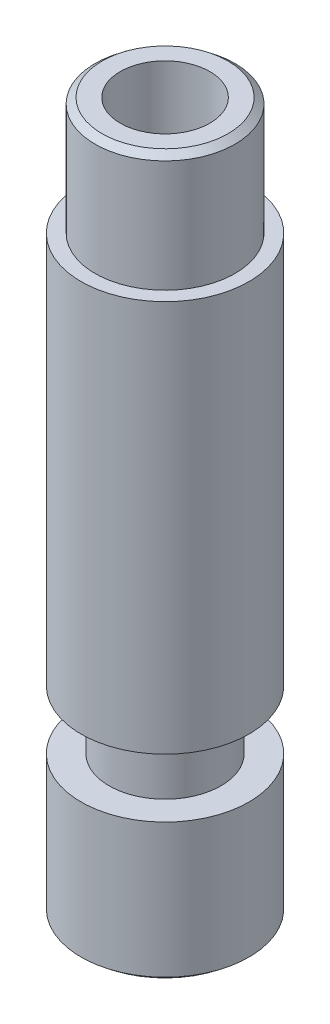
ISO-10303-21;
HEADER;
FILE_DESCRIPTION(('STEP AP214'),'2;1');
FILE_NAME('part.step','',(''),(''),'','','');
FILE_SCHEMA(('AUTOMOTIVE_DESIGN { 1 0 10303 214 1 1 1 1 }'));
ENDSEC;
DATA;
#1=APPLICATION_CONTEXT('core data for automotive mechanical design processes');
#2=APPLICATION_PROTOCOL_DEFINITION('international standard','automotive_design',2000,#1);
#3=PRODUCT_CONTEXT('',#1,'mechanical');
#4=PRODUCT('Part','Part','',(#3));
#5=PRODUCT_RELATED_PRODUCT_CATEGORY('part','',(#4));
#6=PRODUCT_DEFINITION_FORMATION('','',#4);
#7=PRODUCT_DEFINITION_CONTEXT('part definition',#1,'design');
#8=PRODUCT_DEFINITION('design','',#6,#7);
#9=PRODUCT_DEFINITION_SHAPE('','',#8);
#10=(LENGTH_UNIT() NAMED_UNIT(*) SI_UNIT(.MILLI.,.METRE.));
#11=(NAMED_UNIT(*) PLANE_ANGLE_UNIT() SI_UNIT($,.RADIAN.));
#12=(NAMED_UNIT(*) SI_UNIT($,.STERADIAN.) SOLID_ANGLE_UNIT());
#13=UNCERTAINTY_MEASURE_WITH_UNIT(LENGTH_MEASURE(1.E-05),#10,'distance_accuracy_value','');
#14=(GEOMETRIC_REPRESENTATION_CONTEXT(3) GLOBAL_UNCERTAINTY_ASSIGNED_CONTEXT((#13)) GLOBAL_UNIT_ASSIGNED_CONTEXT((#10,
#11,#12)) REPRESENTATION_CONTEXT('',''));
#15=CARTESIAN_POINT('',(0.,0.,0.));
#16=DIRECTION('',(0.,0.,1.));
#17=DIRECTION('',(1.,0.,0.));
#18=AXIS2_PLACEMENT_3D('',#15,#16,#17);
#19=CARTESIAN_POINT('',(0.,0.,0.));
#20=DIRECTION('',(0.,-1.,0.));
#21=DIRECTION('',(0.,0.,-1.));
#22=AXIS2_PLACEMENT_3D('',#19,#20,#21);
#23=CYLINDRICAL_SURFACE('',#22,3.);
#24=CARTESIAN_POINT('',(0.,4.99999999999999,0.));
#25=DIRECTION('',(0.,-1.,0.));
#26=DIRECTION('',(0.,0.,-1.));
#27=AXIS2_PLACEMENT_3D('',#24,#25,#26);
#28=CIRCLE('',#27,3.);
#29=CARTESIAN_POINT('',(0.,4.99999999999999,-3.));
#30=VERTEX_POINT('',#29);
#31=EDGE_CURVE('E10',#30,#30,#28,.T.);
#32=ORIENTED_EDGE('',*,*,#31,.T.);
#33=EDGE_LOOP('',(#32));
#34=FACE_BOUND('',#33,.T.);
#35=CARTESIAN_POINT('',(0.,0.199999999999982,0.));
#36=DIRECTION('',(0.,-1.,0.));
#37=DIRECTION('',(0.,0.,-1.));
#38=AXIS2_PLACEMENT_3D('',#35,#36,#37);
#39=CIRCLE('',#38,3.);
#40=CARTESIAN_POINT('',(0.,0.199999999999982,-3.));
#41=VERTEX_POINT('',#40);
#42=EDGE_CURVE('E65',#41,#41,#39,.T.);
#43=ORIENTED_EDGE('',*,*,#42,.F.);
#44=EDGE_LOOP('',(#43));
#45=FACE_BOUND('',#44,.T.);
#46=ADVANCED_FACE('F31',(#34,#45),#23,.T.);
#47=CARTESIAN_POINT('',(3.,4.99999999999999,0.));
#48=DIRECTION('',(0.,1.,0.));
#49=DIRECTION('',(0.,0.,1.));
#50=AXIS2_PLACEMENT_3D('',#47,#48,#49);
#51=PLANE('',#50);
#52=CARTESIAN_POINT('',(0.,5.,0.));
#53=DIRECTION('',(0.,-1.,0.));
#54=DIRECTION('',(0.,0.,-1.));
#55=AXIS2_PLACEMENT_3D('',#52,#53,#54);
#56=CIRCLE('',#55,2.);
#57=CARTESIAN_POINT('',(0.,5.,-2.));
#58=VERTEX_POINT('',#57);
#59=EDGE_CURVE('E37',#58,#58,#56,.T.);
#60=ORIENTED_EDGE('',*,*,#59,.T.);
#61=EDGE_LOOP('',(#60));
#62=FACE_BOUND('',#61,.T.);
#63=ORIENTED_EDGE('',*,*,#31,.F.);
#64=EDGE_LOOP('',(#63));
#65=FACE_BOUND('',#64,.T.);
#66=ADVANCED_FACE('F124',(#62,#65),#51,.T.);
#67=CARTESIAN_POINT('',(0.,0.,0.));
#68=DIRECTION('',(0.,-1.,0.));
#69=DIRECTION('',(0.,0.,-1.));
#70=AXIS2_PLACEMENT_3D('',#67,#68,#69);
#71=CYLINDRICAL_SURFACE('',#70,2.);
#72=CARTESIAN_POINT('',(0.,7.1,0.));
#73=DIRECTION('',(0.,-1.,0.));
#74=DIRECTION('',(0.,0.,-1.));
#75=AXIS2_PLACEMENT_3D('',#72,#73,#74);
#76=CIRCLE('',#75,2.);
#77=CARTESIAN_POINT('',(0.,7.1,-2.));
#78=VERTEX_POINT('',#77);
#79=EDGE_CURVE('E41',#78,#78,#76,.T.);
#80=ORIENTED_EDGE('',*,*,#79,.T.);
#81=EDGE_LOOP('',(#80));
#82=FACE_BOUND('',#81,.T.);
#83=ORIENTED_EDGE('',*,*,#59,.F.);
#84=EDGE_LOOP('',(#83));
#85=FACE_BOUND('',#84,.T.);
#86=ADVANCED_FACE('F118',(#82,#85),#71,.T.);
#87=CARTESIAN_POINT('',(2.,7.1,0.));
#88=DIRECTION('',(0.,-1.,0.));
#89=DIRECTION('',(0.,0.,-1.));
#90=AXIS2_PLACEMENT_3D('',#87,#88,#89);
#91=PLANE('',#90);
#92=CARTESIAN_POINT('',(0.,7.1,0.));
#93=DIRECTION('',(0.,-1.,0.));
#94=DIRECTION('',(0.,0.,-1.));
#95=AXIS2_PLACEMENT_3D('',#92,#93,#94);
#96=CIRCLE('',#95,3.);
#97=CARTESIAN_POINT('',(0.,7.1,-3.));
#98=VERTEX_POINT('',#97);
#99=EDGE_CURVE('E45',#98,#98,#96,.T.);
#100=ORIENTED_EDGE('',*,*,#99,.T.);
#101=EDGE_LOOP('',(#100));
#102=FACE_BOUND('',#101,.T.);
#103=ORIENTED_EDGE('',*,*,#79,.F.);
#104=EDGE_LOOP('',(#103));
#105=FACE_BOUND('',#104,.T.);
#106=ADVANCED_FACE('F112',(#102,#105),#91,.T.);
#107=CARTESIAN_POINT('',(0.,0.,0.));
#108=DIRECTION('',(0.,-1.,0.));
#109=DIRECTION('',(0.,0.,-1.));
#110=AXIS2_PLACEMENT_3D('',#107,#108,#109);
#111=CYLINDRICAL_SURFACE('',#110,3.);
#112=CARTESIAN_POINT('',(0.,21.1,0.));
#113=DIRECTION('',(0.,-1.,0.));
#114=DIRECTION('',(0.,0.,-1.));
#115=AXIS2_PLACEMENT_3D('',#112,#113,#114);
#116=CIRCLE('',#115,3.);
#117=CARTESIAN_POINT('',(0.,21.1,-3.));
#118=VERTEX_POINT('',#117);
#119=EDGE_CURVE('E50',#118,#118,#116,.T.);
#120=ORIENTED_EDGE('',*,*,#119,.T.);
#121=EDGE_LOOP('',(#120));
#122=FACE_BOUND('',#121,.T.);
#123=ORIENTED_EDGE('',*,*,#99,.F.);
#124=EDGE_LOOP('',(#123));
#125=FACE_BOUND('',#124,.T.);
#126=ADVANCED_FACE('F106',(#122,#125),#111,.T.);
#127=CARTESIAN_POINT('',(3.,21.1,0.));
#128=DIRECTION('',(0.,1.,0.));
#129=DIRECTION('',(0.,0.,1.));
#130=AXIS2_PLACEMENT_3D('',#127,#128,#129);
#131=PLANE('',#130);
#132=CARTESIAN_POINT('',(0.,21.1,0.));
#133=DIRECTION('',(0.,-1.,0.));
#134=DIRECTION('',(0.,0.,-1.));
#135=AXIS2_PLACEMENT_3D('',#132,#133,#134);
#136=CIRCLE('',#135,2.5);
#137=CARTESIAN_POINT('',(0.,21.1,-2.5));
#138=VERTEX_POINT('',#137);
#139=EDGE_CURVE('E53',#138,#138,#136,.T.);
#140=ORIENTED_EDGE('',*,*,#139,.T.);
#141=EDGE_LOOP('',(#140));
#142=FACE_BOUND('',#141,.T.);
#143=ORIENTED_EDGE('',*,*,#119,.F.);
#144=EDGE_LOOP('',(#143));
#145=FACE_BOUND('',#144,.T.);
#146=ADVANCED_FACE('F100',(#142,#145),#131,.T.);
#147=CARTESIAN_POINT('',(0.,0.,0.));
#148=DIRECTION('',(0.,-1.,0.));
#149=DIRECTION('',(0.,0.,-1.));
#150=AXIS2_PLACEMENT_3D('',#147,#148,#149);
#151=CYLINDRICAL_SURFACE('',#150,2.5);
#152=CARTESIAN_POINT('',(0.,25.1,0.));
#153=DIRECTION('',(0.,-1.,0.));
#154=DIRECTION('',(0.,0.,-1.));
#155=AXIS2_PLACEMENT_3D('',#152,#153,#154);
#156=CIRCLE('',#155,2.5);
#157=CARTESIAN_POINT('',(0.,25.1,-2.5));
#158=VERTEX_POINT('',#157);
#159=EDGE_CURVE('E56',#158,#158,#156,.T.);
#160=ORIENTED_EDGE('',*,*,#159,.T.);
#161=EDGE_LOOP('',(#160));
#162=FACE_BOUND('',#161,.T.);
#163=ORIENTED_EDGE('',*,*,#139,.F.);
#164=EDGE_LOOP('',(#163));
#165=FACE_BOUND('',#164,.T.);
#166=ADVANCED_FACE('F94',(#162,#165),#151,.T.);
#167=CARTESIAN_POINT('',(0.,25.1,0.));
#168=DIRECTION('',(0.,-1.,0.));
#169=DIRECTION('',(0.,0.,-1.));
#170=AXIS2_PLACEMENT_3D('',#167,#168,#169);
#171=CONICAL_SURFACE('',#170,2.5,0.896055384571335);
#172=CARTESIAN_POINT('',(0.,25.3,0.));
#173=DIRECTION('',(0.,-1.,0.));
#174=DIRECTION('',(0.,0.,-1.));
#175=AXIS2_PLACEMENT_3D('',#172,#173,#174);
#176=CIRCLE('',#175,2.25);
#177=CARTESIAN_POINT('',(0.,25.3,-2.25));
#178=VERTEX_POINT('',#177);
#179=EDGE_CURVE('E59',#178,#178,#176,.T.);
#180=ORIENTED_EDGE('',*,*,#179,.T.);
#181=EDGE_LOOP('',(#180));
#182=FACE_BOUND('',#181,.T.);
#183=ORIENTED_EDGE('',*,*,#159,.F.);
#184=EDGE_LOOP('',(#183));
#185=FACE_BOUND('',#184,.T.);
#186=ADVANCED_FACE('F88',(#182,#185),#171,.T.);
#187=CARTESIAN_POINT('',(2.25,25.3,0.));
#188=DIRECTION('',(0.,1.,0.));
#189=DIRECTION('',(0.,0.,1.));
#190=AXIS2_PLACEMENT_3D('',#187,#188,#189);
#191=PLANE('',#190);
#192=CARTESIAN_POINT('',(0.,25.3,0.));
#193=DIRECTION('',(0.,1.,0.));
#194=DIRECTION('',(0.,0.,1.));
#195=AXIS2_PLACEMENT_3D('',#192,#193,#194);
#196=CIRCLE('',#195,1.6);
#197=CARTESIAN_POINT('',(0.,25.3,1.6));
#198=VERTEX_POINT('',#197);
#199=EDGE_CURVE('E69',#198,#198,#196,.T.);
#200=ORIENTED_EDGE('',*,*,#199,.F.);
#201=EDGE_LOOP('',(#200));
#202=FACE_BOUND('',#201,.T.);
#203=ORIENTED_EDGE('',*,*,#179,.F.);
#204=EDGE_LOOP('',(#203));
#205=FACE_BOUND('',#204,.T.);
#206=ADVANCED_FACE('F85',(#202,#205),#191,.T.);
#207=CARTESIAN_POINT('',(2.74999999999999,0.,0.));
#208=DIRECTION('',(0.,-1.,0.));
#209=DIRECTION('',(0.,0.,-1.));
#210=AXIS2_PLACEMENT_3D('',#207,#208,#209);
#211=PLANE('',#210);
#212=CARTESIAN_POINT('',(0.,0.,0.));
#213=DIRECTION('',(0.,1.,0.));
#214=DIRECTION('',(0.,0.,1.));
#215=AXIS2_PLACEMENT_3D('',#212,#213,#214);
#216=CIRCLE('',#215,1.6);
#217=CARTESIAN_POINT('',(0.,0.,1.6));
#218=VERTEX_POINT('',#217);
#219=EDGE_CURVE('E68',#218,#218,#216,.T.);
#220=ORIENTED_EDGE('',*,*,#219,.T.);
#221=EDGE_LOOP('',(#220));
#222=FACE_BOUND('',#221,.T.);
#223=CARTESIAN_POINT('',(0.,0.,0.));
#224=DIRECTION('',(0.,-1.,0.));
#225=DIRECTION('',(0.,0.,-1.));
#226=AXIS2_PLACEMENT_3D('',#223,#224,#225);
#227=CIRCLE('',#226,2.74999999999999);
#228=CARTESIAN_POINT('',(0.,0.,-2.74999999999999));
#229=VERTEX_POINT('',#228);
#230=EDGE_CURVE('E62',#229,#229,#227,.T.);
#231=ORIENTED_EDGE('',*,*,#230,.T.);
#232=EDGE_LOOP('',(#231));
#233=FACE_BOUND('',#232,.T.);
#234=ADVANCED_FACE('F75',(#222,#233),#211,.T.);
#235=CARTESIAN_POINT('',(0.,0.,0.));
#236=DIRECTION('',(0.,1.,0.));
#237=DIRECTION('',(0.,0.,1.));
#238=AXIS2_PLACEMENT_3D('',#235,#236,#237);
#239=CONICAL_SURFACE('',#238,2.74999999999999,0.896055384571393);
#240=ORIENTED_EDGE('',*,*,#42,.T.);
#241=EDGE_LOOP('',(#240));
#242=FACE_BOUND('',#241,.T.);
#243=ORIENTED_EDGE('',*,*,#230,.F.);
#244=EDGE_LOOP('',(#243));
#245=FACE_BOUND('',#244,.T.);
#246=ADVANCED_FACE('F81',(#242,#245),#239,.T.);
#247=CARTESIAN_POINT('',(0.,0.,0.));
#248=DIRECTION('',(0.,1.,0.));
#249=DIRECTION('',(0.,0.,1.));
#250=AXIS2_PLACEMENT_3D('',#247,#248,#249);
#251=CYLINDRICAL_SURFACE('',#250,1.6);
#252=ORIENTED_EDGE('',*,*,#219,.F.);
#253=EDGE_LOOP('',(#252));
#254=FACE_BOUND('',#253,.T.);
#255=ORIENTED_EDGE('',*,*,#199,.T.);
#256=EDGE_LOOP('',(#255));
#257=FACE_BOUND('',#256,.T.);
#258=ADVANCED_FACE('F78',(#254,#257),#251,.F.);
#259=CLOSED_SHELL('',(#46,#66,#86,#106,#126,#146,#166,#186,#206,#234,#246,#258));
#260=MANIFOLD_SOLID_BREP('B2',#259);
#261=ADVANCED_BREP_SHAPE_REPRESENTATION('',(#18,#260),#14);
#262=SHAPE_DEFINITION_REPRESENTATION(#9,#261);
ENDSEC;
END-ISO-10303-21;
